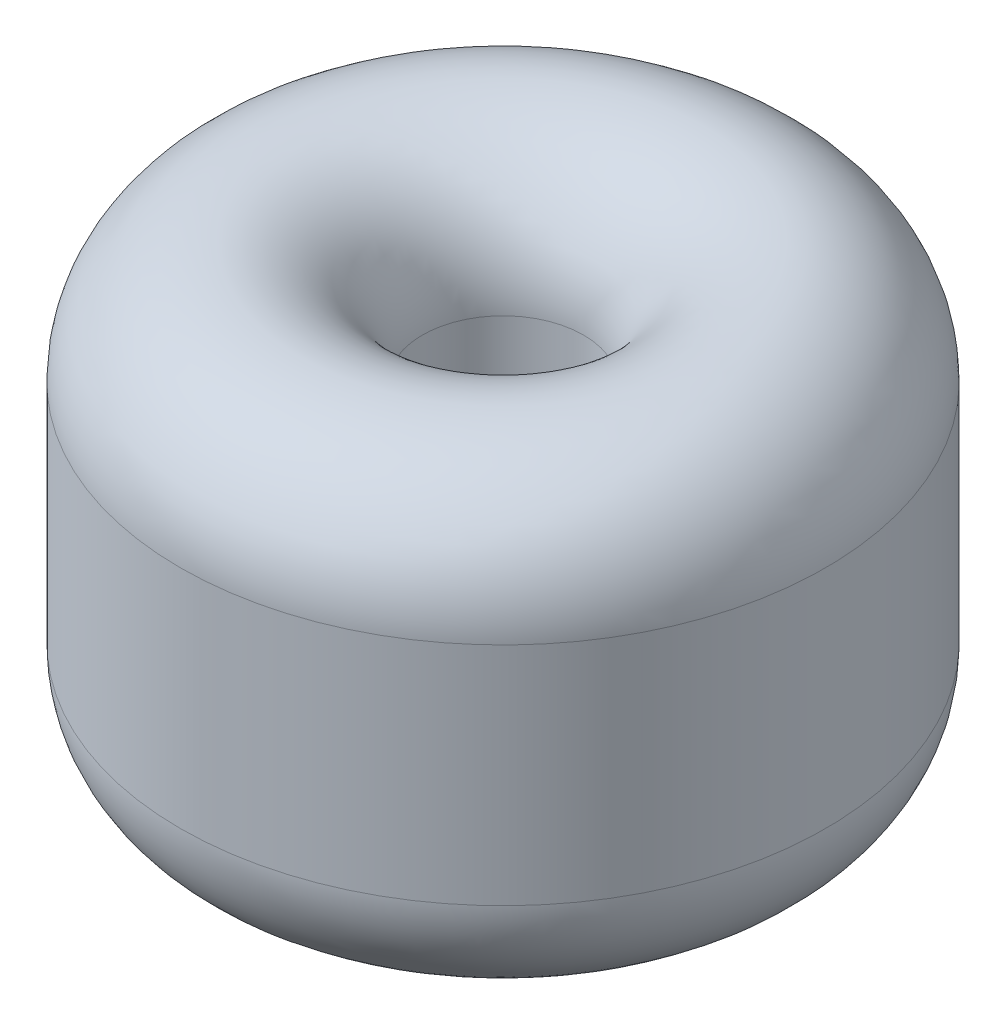
ISO-10303-21;
HEADER;
FILE_DESCRIPTION(('STEP AP214'),'2;1');
FILE_NAME('part.step','',(''),(''),'','','');
FILE_SCHEMA(('AUTOMOTIVE_DESIGN { 1 0 10303 214 1 1 1 1 }'));
ENDSEC;
DATA;
#1=APPLICATION_CONTEXT('core data for automotive mechanical design processes');
#2=APPLICATION_PROTOCOL_DEFINITION('international standard','automotive_design',2000,#1);
#3=PRODUCT_CONTEXT('',#1,'mechanical');
#4=PRODUCT('Part','Part','',(#3));
#5=PRODUCT_RELATED_PRODUCT_CATEGORY('part','',(#4));
#6=PRODUCT_DEFINITION_FORMATION('','',#4);
#7=PRODUCT_DEFINITION_CONTEXT('part definition',#1,'design');
#8=PRODUCT_DEFINITION('design','',#6,#7);
#9=PRODUCT_DEFINITION_SHAPE('','',#8);
#10=(LENGTH_UNIT() NAMED_UNIT(*) SI_UNIT(.MILLI.,.METRE.));
#11=(NAMED_UNIT(*) PLANE_ANGLE_UNIT() SI_UNIT($,.RADIAN.));
#12=(NAMED_UNIT(*) SI_UNIT($,.STERADIAN.) SOLID_ANGLE_UNIT());
#13=UNCERTAINTY_MEASURE_WITH_UNIT(LENGTH_MEASURE(1.E-05),#10,'distance_accuracy_value','');
#14=(GEOMETRIC_REPRESENTATION_CONTEXT(3) GLOBAL_UNCERTAINTY_ASSIGNED_CONTEXT((#13)) GLOBAL_UNIT_ASSIGNED_CONTEXT((#10,
#11,#12)) REPRESENTATION_CONTEXT('',''));
#15=CARTESIAN_POINT('',(0.,0.,0.));
#16=DIRECTION('',(0.,0.,1.));
#17=DIRECTION('',(1.,0.,0.));
#18=AXIS2_PLACEMENT_3D('',#15,#16,#17);
#19=CARTESIAN_POINT('',(0.,14.,0.));
#20=DIRECTION('',(0.,-1.,0.));
#21=DIRECTION('',(0.,0.,-1.));
#22=AXIS2_PLACEMENT_3D('',#19,#20,#21);
#23=TOROIDAL_SURFACE('',#22,25.,15.);
#24=CARTESIAN_POINT('',(0.,14.,0.));
#25=DIRECTION('',(0.,-1.,0.));
#26=DIRECTION('',(0.,0.,-1.));
#27=AXIS2_PLACEMENT_3D('',#24,#25,#26);
#28=CIRCLE('',#27,40.);
#29=CARTESIAN_POINT('',(0.,14.,-40.));
#30=VERTEX_POINT('',#29);
#31=EDGE_CURVE('E47',#30,#30,#28,.T.);
#32=ORIENTED_EDGE('',*,*,#31,.F.);
#33=EDGE_LOOP('',(#32));
#34=FACE_BOUND('',#33,.T.);
#35=CARTESIAN_POINT('',(0.,14.,0.));
#36=DIRECTION('',(0.,-1.,0.));
#37=DIRECTION('',(0.,0.,-1.));
#38=AXIS2_PLACEMENT_3D('',#35,#36,#37);
#39=CIRCLE('',#38,10.);
#40=CARTESIAN_POINT('',(0.,14.,-10.));
#41=VERTEX_POINT('',#40);
#42=EDGE_CURVE('E10',#41,#41,#39,.T.);
#43=ORIENTED_EDGE('',*,*,#42,.T.);
#44=EDGE_LOOP('',(#43));
#45=FACE_BOUND('',#44,.T.);
#46=ADVANCED_FACE('F33',(#34,#45),#23,.T.);
#47=CARTESIAN_POINT('',(0.,0.,0.));
#48=DIRECTION('',(0.,-1.,0.));
#49=DIRECTION('',(0.,0.,-1.));
#50=AXIS2_PLACEMENT_3D('',#47,#48,#49);
#51=CYLINDRICAL_SURFACE('',#50,9.99999999999999);
#52=ORIENTED_EDGE('',*,*,#42,.F.);
#53=EDGE_LOOP('',(#52));
#54=FACE_BOUND('',#53,.T.);
#55=CARTESIAN_POINT('',(0.,-14.,0.));
#56=DIRECTION('',(0.,-1.,0.));
#57=DIRECTION('',(0.,0.,-1.));
#58=AXIS2_PLACEMENT_3D('',#55,#56,#57);
#59=CIRCLE('',#58,9.99999999999999);
#60=CARTESIAN_POINT('',(0.,-14.,-9.99999999999999));
#61=VERTEX_POINT('',#60);
#62=EDGE_CURVE('E39',#61,#61,#59,.T.);
#63=ORIENTED_EDGE('',*,*,#62,.T.);
#64=EDGE_LOOP('',(#63));
#65=FACE_BOUND('',#64,.T.);
#66=ADVANCED_FACE('F56',(#54,#65),#51,.F.);
#67=CARTESIAN_POINT('',(0.,-14.,0.));
#68=DIRECTION('',(0.,-1.,0.));
#69=DIRECTION('',(0.,0.,-1.));
#70=AXIS2_PLACEMENT_3D('',#67,#68,#69);
#71=TOROIDAL_SURFACE('',#70,25.,15.);
#72=ORIENTED_EDGE('',*,*,#62,.F.);
#73=EDGE_LOOP('',(#72));
#74=FACE_BOUND('',#73,.T.);
#75=CARTESIAN_POINT('',(0.,-14.,0.));
#76=DIRECTION('',(0.,-1.,0.));
#77=DIRECTION('',(0.,0.,-1.));
#78=AXIS2_PLACEMENT_3D('',#75,#76,#77);
#79=CIRCLE('',#78,40.);
#80=CARTESIAN_POINT('',(0.,-14.,-40.));
#81=VERTEX_POINT('',#80);
#82=EDGE_CURVE('E43',#81,#81,#79,.T.);
#83=ORIENTED_EDGE('',*,*,#82,.T.);
#84=EDGE_LOOP('',(#83));
#85=FACE_BOUND('',#84,.T.);
#86=ADVANCED_FACE('F60',(#74,#85),#71,.T.);
#87=CARTESIAN_POINT('',(0.,0.,0.));
#88=DIRECTION('',(0.,-1.,0.));
#89=DIRECTION('',(0.,0.,-1.));
#90=AXIS2_PLACEMENT_3D('',#87,#88,#89);
#91=CYLINDRICAL_SURFACE('',#90,40.);
#92=ORIENTED_EDGE('',*,*,#82,.F.);
#93=EDGE_LOOP('',(#92));
#94=FACE_BOUND('',#93,.T.);
#95=ORIENTED_EDGE('',*,*,#31,.T.);
#96=EDGE_LOOP('',(#95));
#97=FACE_BOUND('',#96,.T.);
#98=ADVANCED_FACE('F53',(#94,#97),#91,.T.);
#99=CLOSED_SHELL('',(#46,#66,#86,#98));
#100=MANIFOLD_SOLID_BREP('B2',#99);
#101=ADVANCED_BREP_SHAPE_REPRESENTATION('',(#18,#100),#14);
#102=SHAPE_DEFINITION_REPRESENTATION(#9,#101);
ENDSEC;
END-ISO-10303-21;
